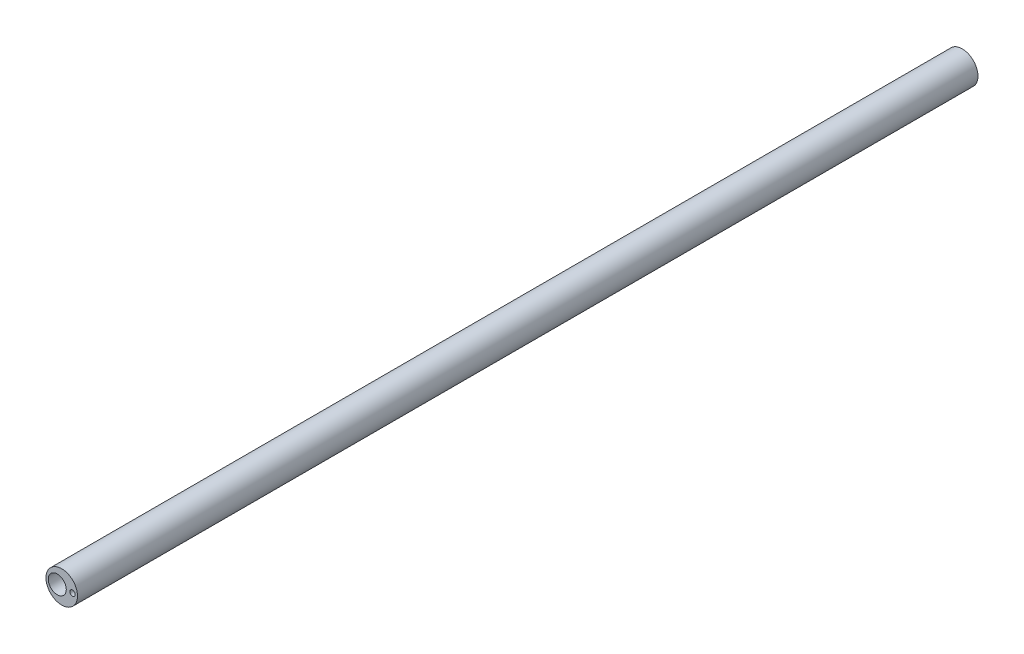
ISO-10303-21;
HEADER;
FILE_DESCRIPTION(('STEP AP214'),'2;1');
FILE_NAME('part.step','',(''),(''),'','','');
FILE_SCHEMA(('AUTOMOTIVE_DESIGN { 1 0 10303 214 1 1 1 1 }'));
ENDSEC;
DATA;
#1=APPLICATION_CONTEXT('core data for automotive mechanical design processes');
#2=APPLICATION_PROTOCOL_DEFINITION('international standard','automotive_design',2000,#1);
#3=PRODUCT_CONTEXT('',#1,'mechanical');
#4=PRODUCT('Part','Part','',(#3));
#5=PRODUCT_RELATED_PRODUCT_CATEGORY('part','',(#4));
#6=PRODUCT_DEFINITION_FORMATION('','',#4);
#7=PRODUCT_DEFINITION_CONTEXT('part definition',#1,'design');
#8=PRODUCT_DEFINITION('design','',#6,#7);
#9=PRODUCT_DEFINITION_SHAPE('','',#8);
#10=(LENGTH_UNIT() NAMED_UNIT(*) SI_UNIT(.MILLI.,.METRE.));
#11=(NAMED_UNIT(*) PLANE_ANGLE_UNIT() SI_UNIT($,.RADIAN.));
#12=(NAMED_UNIT(*) SI_UNIT($,.STERADIAN.) SOLID_ANGLE_UNIT());
#13=UNCERTAINTY_MEASURE_WITH_UNIT(LENGTH_MEASURE(1.E-05),#10,'distance_accuracy_value','');
#14=(GEOMETRIC_REPRESENTATION_CONTEXT(3) GLOBAL_UNCERTAINTY_ASSIGNED_CONTEXT((#13)) GLOBAL_UNIT_ASSIGNED_CONTEXT((#10,
#11,#12)) REPRESENTATION_CONTEXT('',''));
#15=CARTESIAN_POINT('',(0.,0.,0.));
#16=DIRECTION('',(0.,0.,1.));
#17=DIRECTION('',(1.,0.,0.));
#18=AXIS2_PLACEMENT_3D('',#15,#16,#17);
#19=CARTESIAN_POINT('',(-0.496,0.,100.));
#20=DIRECTION('',(0.,0.,-1.));
#21=DIRECTION('',(-1.,0.,0.));
#22=AXIS2_PLACEMENT_3D('',#19,#20,#21);
#23=CYLINDRICAL_SURFACE('',#22,1.);
#24=CARTESIAN_POINT('',(-0.496,0.,100.));
#25=DIRECTION('',(0.,0.,1.));
#26=DIRECTION('',(1.,0.,0.));
#27=AXIS2_PLACEMENT_3D('',#24,#25,#26);
#28=CIRCLE('',#27,1.);
#29=CARTESIAN_POINT('',(0.504,0.,100.));
#30=VERTEX_POINT('',#29);
#31=EDGE_CURVE('E42',#30,#30,#28,.T.);
#32=ORIENTED_EDGE('',*,*,#31,.T.);
#33=EDGE_LOOP('',(#32));
#34=FACE_BOUND('',#33,.T.);
#35=CARTESIAN_POINT('',(-0.496,0.,0.));
#36=DIRECTION('',(0.,0.,1.));
#37=DIRECTION('',(1.,0.,0.));
#38=AXIS2_PLACEMENT_3D('',#35,#36,#37);
#39=CIRCLE('',#38,1.);
#40=CARTESIAN_POINT('',(0.504,0.,0.));
#41=VERTEX_POINT('',#40);
#42=EDGE_CURVE('E53',#41,#41,#39,.T.);
#43=ORIENTED_EDGE('',*,*,#42,.F.);
#44=EDGE_LOOP('',(#43));
#45=FACE_BOUND('',#44,.T.);
#46=ADVANCED_FACE('F34',(#34,#45),#23,.F.);
#47=CARTESIAN_POINT('',(1.196,0.,100.));
#48=DIRECTION('',(0.,0.,-1.));
#49=DIRECTION('',(-1.,0.,0.));
#50=AXIS2_PLACEMENT_3D('',#47,#48,#49);
#51=CYLINDRICAL_SURFACE('',#50,0.3);
#52=CARTESIAN_POINT('',(1.196,0.,100.));
#53=DIRECTION('',(0.,0.,1.));
#54=DIRECTION('',(1.,0.,0.));
#55=AXIS2_PLACEMENT_3D('',#52,#53,#54);
#56=CIRCLE('',#55,0.3);
#57=CARTESIAN_POINT('',(1.496,0.,100.));
#58=VERTEX_POINT('',#57);
#59=EDGE_CURVE('E47',#58,#58,#56,.T.);
#60=ORIENTED_EDGE('',*,*,#59,.T.);
#61=EDGE_LOOP('',(#60));
#62=FACE_BOUND('',#61,.T.);
#63=CARTESIAN_POINT('',(1.196,0.,0.));
#64=DIRECTION('',(0.,0.,1.));
#65=DIRECTION('',(1.,0.,0.));
#66=AXIS2_PLACEMENT_3D('',#63,#64,#65);
#67=CIRCLE('',#66,0.3);
#68=CARTESIAN_POINT('',(1.496,0.,0.));
#69=VERTEX_POINT('',#68);
#70=EDGE_CURVE('E51',#69,#69,#67,.T.);
#71=ORIENTED_EDGE('',*,*,#70,.F.);
#72=EDGE_LOOP('',(#71));
#73=FACE_BOUND('',#72,.T.);
#74=ADVANCED_FACE('F36',(#62,#73),#51,.F.);
#75=CARTESIAN_POINT('',(0.,0.,100.));
#76=DIRECTION('',(0.,0.,-1.));
#77=DIRECTION('',(-1.,0.,0.));
#78=AXIS2_PLACEMENT_3D('',#75,#76,#77);
#79=CYLINDRICAL_SURFACE('',#78,1.75);
#80=CARTESIAN_POINT('',(0.,0.,100.));
#81=DIRECTION('',(0.,0.,1.));
#82=DIRECTION('',(1.,0.,0.));
#83=AXIS2_PLACEMENT_3D('',#80,#81,#82);
#84=CIRCLE('',#83,1.75);
#85=CARTESIAN_POINT('',(1.75,0.,100.));
#86=VERTEX_POINT('',#85);
#87=EDGE_CURVE('E10',#86,#86,#84,.T.);
#88=ORIENTED_EDGE('',*,*,#87,.F.);
#89=EDGE_LOOP('',(#88));
#90=FACE_BOUND('',#89,.T.);
#91=CARTESIAN_POINT('',(0.,0.,0.));
#92=DIRECTION('',(0.,0.,1.));
#93=DIRECTION('',(1.,0.,0.));
#94=AXIS2_PLACEMENT_3D('',#91,#92,#93);
#95=CIRCLE('',#94,1.75);
#96=CARTESIAN_POINT('',(1.75,0.,0.));
#97=VERTEX_POINT('',#96);
#98=EDGE_CURVE('E38',#97,#97,#95,.T.);
#99=ORIENTED_EDGE('',*,*,#98,.T.);
#100=EDGE_LOOP('',(#99));
#101=FACE_BOUND('',#100,.T.);
#102=ADVANCED_FACE('F69',(#90,#101),#79,.T.);
#103=CARTESIAN_POINT('',(0.,0.,100.));
#104=DIRECTION('',(0.,0.,1.));
#105=DIRECTION('',(1.,0.,0.));
#106=AXIS2_PLACEMENT_3D('',#103,#104,#105);
#107=PLANE('',#106);
#108=ORIENTED_EDGE('',*,*,#59,.F.);
#109=EDGE_LOOP('',(#108));
#110=FACE_BOUND('',#109,.T.);
#111=ORIENTED_EDGE('',*,*,#31,.F.);
#112=EDGE_LOOP('',(#111));
#113=FACE_BOUND('',#112,.T.);
#114=ORIENTED_EDGE('',*,*,#87,.T.);
#115=EDGE_LOOP('',(#114));
#116=FACE_BOUND('',#115,.T.);
#117=ADVANCED_FACE('F65',(#110,#113,#116),#107,.T.);
#118=CARTESIAN_POINT('',(0.,0.,0.));
#119=DIRECTION('',(0.,0.,1.));
#120=DIRECTION('',(1.,0.,0.));
#121=AXIS2_PLACEMENT_3D('',#118,#119,#120);
#122=PLANE('',#121);
#123=ORIENTED_EDGE('',*,*,#70,.T.);
#124=EDGE_LOOP('',(#123));
#125=FACE_BOUND('',#124,.T.);
#126=ORIENTED_EDGE('',*,*,#42,.T.);
#127=EDGE_LOOP('',(#126));
#128=FACE_BOUND('',#127,.T.);
#129=ORIENTED_EDGE('',*,*,#98,.F.);
#130=EDGE_LOOP('',(#129));
#131=FACE_BOUND('',#130,.T.);
#132=ADVANCED_FACE('F68',(#125,#128,#131),#122,.F.);
#133=CLOSED_SHELL('',(#46,#74,#102,#117,#132));
#134=MANIFOLD_SOLID_BREP('B2',#133);
#135=ADVANCED_BREP_SHAPE_REPRESENTATION('',(#18,#134),#14);
#136=SHAPE_DEFINITION_REPRESENTATION(#9,#135);
ENDSEC;
END-ISO-10303-21;
